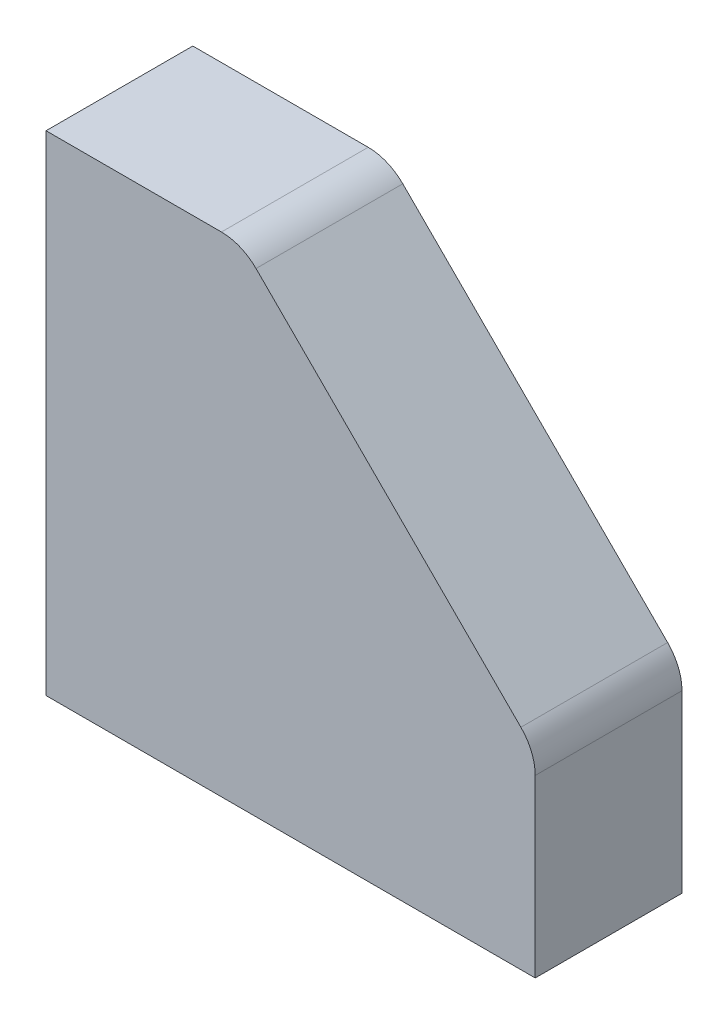
ISO-10303-21;
HEADER;
FILE_DESCRIPTION(('STEP AP214'),'2;1');
FILE_NAME('part.step','',(''),(''),'','','');
FILE_SCHEMA(('AUTOMOTIVE_DESIGN { 1 0 10303 214 1 1 1 1 }'));
ENDSEC;
DATA;
#1=APPLICATION_CONTEXT('core data for automotive mechanical design processes');
#2=APPLICATION_PROTOCOL_DEFINITION('international standard','automotive_design',2000,#1);
#3=PRODUCT_CONTEXT('',#1,'mechanical');
#4=PRODUCT('Part','Part','',(#3));
#5=PRODUCT_RELATED_PRODUCT_CATEGORY('part','',(#4));
#6=PRODUCT_DEFINITION_FORMATION('','',#4);
#7=PRODUCT_DEFINITION_CONTEXT('part definition',#1,'design');
#8=PRODUCT_DEFINITION('design','',#6,#7);
#9=PRODUCT_DEFINITION_SHAPE('','',#8);
#10=(LENGTH_UNIT() NAMED_UNIT(*) SI_UNIT(.MILLI.,.METRE.));
#11=(NAMED_UNIT(*) PLANE_ANGLE_UNIT() SI_UNIT($,.RADIAN.));
#12=(NAMED_UNIT(*) SI_UNIT($,.STERADIAN.) SOLID_ANGLE_UNIT());
#13=UNCERTAINTY_MEASURE_WITH_UNIT(LENGTH_MEASURE(1.E-05),#10,'distance_accuracy_value','');
#14=(GEOMETRIC_REPRESENTATION_CONTEXT(3) GLOBAL_UNCERTAINTY_ASSIGNED_CONTEXT((#13)) GLOBAL_UNIT_ASSIGNED_CONTEXT((#10,
#11,#12)) REPRESENTATION_CONTEXT('',''));
#15=CARTESIAN_POINT('',(0.,0.,0.));
#16=DIRECTION('',(0.,0.,1.));
#17=DIRECTION('',(1.,0.,0.));
#18=AXIS2_PLACEMENT_3D('',#15,#16,#17);
#19=CARTESIAN_POINT('',(0.,0.,15.));
#20=DIRECTION('',(1.,0.,0.));
#21=DIRECTION('',(0.,0.,-1.));
#22=AXIS2_PLACEMENT_3D('',#19,#20,#21);
#23=PLANE('',#22);
#24=CARTESIAN_POINT('',(0.,40.,7.5));
#25=DIRECTION('',(-1.,0.,0.));
#26=DIRECTION('',(0.,0.,1.));
#27=AXIS2_PLACEMENT_3D('',#24,#25,#26);
#28=CIRCLE('',#27,1.64999999999999);
#29=CARTESIAN_POINT('',(0.,40.,9.14999999999999));
#30=VERTEX_POINT('',#29);
#31=EDGE_CURVE('E143',#30,#30,#28,.T.);
#32=ORIENTED_EDGE('',*,*,#31,.F.);
#33=EDGE_LOOP('',(#32));
#34=FACE_BOUND('',#33,.T.);
#35=CARTESIAN_POINT('',(0.,15.,7.5));
#36=DIRECTION('',(-1.,0.,0.));
#37=DIRECTION('',(0.,0.,1.));
#38=AXIS2_PLACEMENT_3D('',#35,#36,#37);
#39=CIRCLE('',#38,1.64999999999999);
#40=CARTESIAN_POINT('',(0.,15.,9.15));
#41=VERTEX_POINT('',#40);
#42=EDGE_CURVE('E149',#41,#41,#39,.T.);
#43=ORIENTED_EDGE('',*,*,#42,.F.);
#44=EDGE_LOOP('',(#43));
#45=FACE_BOUND('',#44,.T.);
#46=DIRECTION('',(0.,-1.,0.));
#47=VECTOR('',#46,1.);
#48=CARTESIAN_POINT('',(0.,0.,0.));
#49=LINE('',#48,#47);
#50=CARTESIAN_POINT('',(0.,50.,0.));
#51=VERTEX_POINT('',#50);
#52=CARTESIAN_POINT('',(0.,0.,0.));
#53=VERTEX_POINT('',#52);
#54=EDGE_CURVE('E155',#51,#53,#49,.T.);
#55=ORIENTED_EDGE('',*,*,#54,.T.);
#56=DIRECTION('',(0.,0.,-1.));
#57=VECTOR('',#56,1.);
#58=CARTESIAN_POINT('',(0.,0.,15.));
#59=LINE('',#58,#57);
#60=CARTESIAN_POINT('',(0.,0.,15.));
#61=VERTEX_POINT('',#60);
#62=EDGE_CURVE('E184',#61,#53,#59,.T.);
#63=ORIENTED_EDGE('',*,*,#62,.F.);
#64=DIRECTION('',(0.,-1.,0.));
#65=VECTOR('',#64,1.);
#66=CARTESIAN_POINT('',(0.,0.,15.));
#67=LINE('',#66,#65);
#68=CARTESIAN_POINT('',(0.,50.,15.));
#69=VERTEX_POINT('',#68);
#70=EDGE_CURVE('E156',#69,#61,#67,.T.);
#71=ORIENTED_EDGE('',*,*,#70,.F.);
#72=DIRECTION('',(0.,0.,-1.));
#73=VECTOR('',#72,1.);
#74=CARTESIAN_POINT('',(0.,50.,15.));
#75=LINE('',#74,#73);
#76=EDGE_CURVE('E168',#69,#51,#75,.T.);
#77=ORIENTED_EDGE('',*,*,#76,.T.);
#78=EDGE_LOOP('',(#55,#63,#71,#77));
#79=FACE_BOUND('',#78,.T.);
#80=ADVANCED_FACE('F41',(#34,#45,#79),#23,.F.);
#81=CARTESIAN_POINT('',(50.,0.,15.));
#82=DIRECTION('',(0.,1.,0.));
#83=DIRECTION('',(0.,0.,1.));
#84=AXIS2_PLACEMENT_3D('',#81,#82,#83);
#85=PLANE('',#84);
#86=CARTESIAN_POINT('',(35.,0.,7.5));
#87=DIRECTION('',(0.,-1.,0.));
#88=DIRECTION('',(0.,0.,-1.));
#89=AXIS2_PLACEMENT_3D('',#86,#87,#88);
#90=CIRCLE('',#89,1.64999999999999);
#91=CARTESIAN_POINT('',(35.,0.,5.85000000000001));
#92=VERTEX_POINT('',#91);
#93=EDGE_CURVE('E127',#92,#92,#90,.T.);
#94=ORIENTED_EDGE('',*,*,#93,.F.);
#95=EDGE_LOOP('',(#94));
#96=FACE_BOUND('',#95,.T.);
#97=CARTESIAN_POINT('',(20.,0.,7.5));
#98=DIRECTION('',(0.,-1.,0.));
#99=DIRECTION('',(0.,0.,-1.));
#100=AXIS2_PLACEMENT_3D('',#97,#98,#99);
#101=CIRCLE('',#100,1.64999999999999);
#102=CARTESIAN_POINT('',(20.,0.,5.85000000000001));
#103=VERTEX_POINT('',#102);
#104=EDGE_CURVE('E126',#103,#103,#101,.T.);
#105=ORIENTED_EDGE('',*,*,#104,.F.);
#106=EDGE_LOOP('',(#105));
#107=FACE_BOUND('',#106,.T.);
#108=CARTESIAN_POINT('',(5.00000000000001,0.,7.5));
#109=DIRECTION('',(0.,-1.,0.));
#110=DIRECTION('',(0.,0.,-1.));
#111=AXIS2_PLACEMENT_3D('',#108,#109,#110);
#112=CIRCLE('',#111,1.64999999999999);
#113=CARTESIAN_POINT('',(5.00000000000001,0.,5.85000000000001));
#114=VERTEX_POINT('',#113);
#115=EDGE_CURVE('E137',#114,#114,#112,.T.);
#116=ORIENTED_EDGE('',*,*,#115,.F.);
#117=EDGE_LOOP('',(#116));
#118=FACE_BOUND('',#117,.T.);
#119=DIRECTION('',(1.,0.,0.));
#120=VECTOR('',#119,1.);
#121=CARTESIAN_POINT('',(50.,0.,0.));
#122=LINE('',#121,#120);
#123=CARTESIAN_POINT('',(50.,0.,0.));
#124=VERTEX_POINT('',#123);
#125=EDGE_CURVE('E171',#53,#124,#122,.T.);
#126=ORIENTED_EDGE('',*,*,#125,.T.);
#127=DIRECTION('',(0.,0.,-1.));
#128=VECTOR('',#127,1.);
#129=CARTESIAN_POINT('',(50.,0.,15.));
#130=LINE('',#129,#128);
#131=CARTESIAN_POINT('',(50.,0.,15.));
#132=VERTEX_POINT('',#131);
#133=EDGE_CURVE('E181',#132,#124,#130,.T.);
#134=ORIENTED_EDGE('',*,*,#133,.F.);
#135=DIRECTION('',(1.,0.,0.));
#136=VECTOR('',#135,1.);
#137=CARTESIAN_POINT('',(50.,0.,15.));
#138=LINE('',#137,#136);
#139=EDGE_CURVE('E159',#61,#132,#138,.T.);
#140=ORIENTED_EDGE('',*,*,#139,.F.);
#141=ORIENTED_EDGE('',*,*,#62,.T.);
#142=EDGE_LOOP('',(#126,#134,#140,#141));
#143=FACE_BOUND('',#142,.T.);
#144=ADVANCED_FACE('F213',(#96,#107,#118,#143),#85,.F.);
#145=CARTESIAN_POINT('',(50.,20.,15.));
#146=DIRECTION('',(-1.,0.,0.));
#147=DIRECTION('',(0.,0.,1.));
#148=AXIS2_PLACEMENT_3D('',#145,#146,#147);
#149=PLANE('',#148);
#150=DIRECTION('',(0.,1.,0.));
#151=VECTOR('',#150,1.);
#152=CARTESIAN_POINT('',(50.,20.,0.));
#153=LINE('',#152,#151);
#154=CARTESIAN_POINT('',(50.,17.9289321881345,0.));
#155=VERTEX_POINT('',#154);
#156=EDGE_CURVE('E173',#124,#155,#153,.T.);
#157=ORIENTED_EDGE('',*,*,#156,.T.);
#158=DIRECTION('',(0.,0.,-1.));
#159=VECTOR('',#158,1.);
#160=CARTESIAN_POINT('',(50.,17.9289321881345,15.));
#161=LINE('',#160,#159);
#162=CARTESIAN_POINT('',(50.,17.9289321881345,15.));
#163=VERTEX_POINT('',#162);
#164=EDGE_CURVE('E64',#155,#163,#161,.F.);
#165=ORIENTED_EDGE('',*,*,#164,.T.);
#166=DIRECTION('',(0.,1.,0.));
#167=VECTOR('',#166,1.);
#168=CARTESIAN_POINT('',(50.,20.,15.));
#169=LINE('',#168,#167);
#170=EDGE_CURVE('E162',#132,#163,#169,.T.);
#171=ORIENTED_EDGE('',*,*,#170,.F.);
#172=ORIENTED_EDGE('',*,*,#133,.T.);
#173=EDGE_LOOP('',(#157,#165,#171,#172));
#174=FACE_BOUND('',#173,.T.);
#175=ADVANCED_FACE('F210',(#174),#149,.F.);
#176=CARTESIAN_POINT('',(20.,50.,15.));
#177=DIRECTION('',(-0.707106781186547,-0.707106781186547,0.));
#178=DIRECTION('',(0.707106781186548,-0.707106781186548,0.));
#179=AXIS2_PLACEMENT_3D('',#176,#177,#178);
#180=PLANE('',#179);
#181=DIRECTION('',(-0.707106781186547,0.707106781186547,0.));
#182=VECTOR('',#181,1.);
#183=CARTESIAN_POINT('',(20.,50.,15.));
#184=LINE('',#183,#182);
#185=CARTESIAN_POINT('',(48.5355339059327,21.4644660940673,15.));
#186=VERTEX_POINT('',#185);
#187=CARTESIAN_POINT('',(21.4644660940673,48.5355339059327,15.));
#188=VERTEX_POINT('',#187);
#189=EDGE_CURVE('E164',#186,#188,#184,.T.);
#190=ORIENTED_EDGE('',*,*,#189,.F.);
#191=DIRECTION('',(0.,0.,-1.));
#192=VECTOR('',#191,1.);
#193=CARTESIAN_POINT('',(48.5355339059327,21.4644660940673,15.));
#194=LINE('',#193,#192);
#195=CARTESIAN_POINT('',(48.5355339059327,21.4644660940673,0.));
#196=VERTEX_POINT('',#195);
#197=EDGE_CURVE('E189',#186,#196,#194,.T.);
#198=ORIENTED_EDGE('',*,*,#197,.T.);
#199=DIRECTION('',(-0.707106781186547,0.707106781186547,0.));
#200=VECTOR('',#199,1.);
#201=CARTESIAN_POINT('',(20.,50.,0.));
#202=LINE('',#201,#200);
#203=CARTESIAN_POINT('',(21.4644660940673,48.5355339059327,0.));
#204=VERTEX_POINT('',#203);
#205=EDGE_CURVE('E175',#196,#204,#202,.T.);
#206=ORIENTED_EDGE('',*,*,#205,.T.);
#207=DIRECTION('',(0.,0.,-1.));
#208=VECTOR('',#207,1.);
#209=CARTESIAN_POINT('',(21.4644660940673,48.5355339059327,15.));
#210=LINE('',#209,#208);
#211=EDGE_CURVE('E187',#204,#188,#210,.F.);
#212=ORIENTED_EDGE('',*,*,#211,.T.);
#213=EDGE_LOOP('',(#190,#198,#206,#212));
#214=FACE_BOUND('',#213,.T.);
#215=ADVANCED_FACE('F203',(#214),#180,.F.);
#216=CARTESIAN_POINT('',(0.,50.,15.));
#217=DIRECTION('',(0.,-1.,0.));
#218=DIRECTION('',(0.,0.,-1.));
#219=AXIS2_PLACEMENT_3D('',#216,#217,#218);
#220=PLANE('',#219);
#221=DIRECTION('',(-1.,0.,0.));
#222=VECTOR('',#221,1.);
#223=CARTESIAN_POINT('',(0.,50.,15.));
#224=LINE('',#223,#222);
#225=CARTESIAN_POINT('',(17.9289321881345,50.,15.));
#226=VERTEX_POINT('',#225);
#227=EDGE_CURVE('E166',#226,#69,#224,.T.);
#228=ORIENTED_EDGE('',*,*,#227,.F.);
#229=DIRECTION('',(0.,0.,-1.));
#230=VECTOR('',#229,1.);
#231=CARTESIAN_POINT('',(17.9289321881345,50.,15.));
#232=LINE('',#231,#230);
#233=CARTESIAN_POINT('',(17.9289321881345,50.,0.));
#234=VERTEX_POINT('',#233);
#235=EDGE_CURVE('E11',#226,#234,#232,.T.);
#236=ORIENTED_EDGE('',*,*,#235,.T.);
#237=DIRECTION('',(-1.,0.,0.));
#238=VECTOR('',#237,1.);
#239=CARTESIAN_POINT('',(0.,50.,0.));
#240=LINE('',#239,#238);
#241=EDGE_CURVE('E160',#234,#51,#240,.T.);
#242=ORIENTED_EDGE('',*,*,#241,.T.);
#243=ORIENTED_EDGE('',*,*,#76,.F.);
#244=EDGE_LOOP('',(#228,#236,#242,#243));
#245=FACE_BOUND('',#244,.T.);
#246=ADVANCED_FACE('F221',(#245),#220,.F.);
#247=CARTESIAN_POINT('',(0.,0.,15.));
#248=DIRECTION('',(0.,0.,-1.));
#249=DIRECTION('',(-1.,0.,0.));
#250=AXIS2_PLACEMENT_3D('',#247,#248,#249);
#251=PLANE('',#250);
#252=ORIENTED_EDGE('',*,*,#170,.T.);
#253=CARTESIAN_POINT('',(45.,17.9289321881345,15.));
#254=DIRECTION('',(0.,0.,-1.));
#255=DIRECTION('',(-1.,0.,0.));
#256=AXIS2_PLACEMENT_3D('',#253,#254,#255);
#257=CIRCLE('',#256,5.);
#258=EDGE_CURVE('E49',#163,#186,#257,.F.);
#259=ORIENTED_EDGE('',*,*,#258,.T.);
#260=ORIENTED_EDGE('',*,*,#189,.T.);
#261=CARTESIAN_POINT('',(17.9289321881345,45.,15.));
#262=DIRECTION('',(0.,0.,-1.));
#263=DIRECTION('',(-1.,0.,0.));
#264=AXIS2_PLACEMENT_3D('',#261,#262,#263);
#265=CIRCLE('',#264,5.);
#266=EDGE_CURVE('E56',#188,#226,#265,.F.);
#267=ORIENTED_EDGE('',*,*,#266,.T.);
#268=ORIENTED_EDGE('',*,*,#227,.T.);
#269=ORIENTED_EDGE('',*,*,#70,.T.);
#270=ORIENTED_EDGE('',*,*,#139,.T.);
#271=EDGE_LOOP('',(#252,#259,#260,#267,#268,#269,#270));
#272=FACE_BOUND('',#271,.T.);
#273=ADVANCED_FACE('F199',(#272),#251,.F.);
#274=CARTESIAN_POINT('',(0.,0.,0.));
#275=DIRECTION('',(0.,0.,-1.));
#276=DIRECTION('',(-1.,0.,0.));
#277=AXIS2_PLACEMENT_3D('',#274,#275,#276);
#278=PLANE('',#277);
#279=ORIENTED_EDGE('',*,*,#205,.F.);
#280=CARTESIAN_POINT('',(45.,17.9289321881345,0.));
#281=DIRECTION('',(0.,0.,-1.));
#282=DIRECTION('',(-1.,0.,0.));
#283=AXIS2_PLACEMENT_3D('',#280,#281,#282);
#284=CIRCLE('',#283,5.);
#285=EDGE_CURVE('E194',#196,#155,#284,.T.);
#286=ORIENTED_EDGE('',*,*,#285,.T.);
#287=ORIENTED_EDGE('',*,*,#156,.F.);
#288=ORIENTED_EDGE('',*,*,#125,.F.);
#289=ORIENTED_EDGE('',*,*,#54,.F.);
#290=ORIENTED_EDGE('',*,*,#241,.F.);
#291=CARTESIAN_POINT('',(17.9289321881345,45.,0.));
#292=DIRECTION('',(0.,0.,-1.));
#293=DIRECTION('',(-1.,0.,0.));
#294=AXIS2_PLACEMENT_3D('',#291,#292,#293);
#295=CIRCLE('',#294,5.);
#296=EDGE_CURVE('E192',#234,#204,#295,.T.);
#297=ORIENTED_EDGE('',*,*,#296,.T.);
#298=EDGE_LOOP('',(#279,#286,#287,#288,#289,#290,#297));
#299=FACE_BOUND('',#298,.T.);
#300=ADVANCED_FACE('F209',(#299),#278,.T.);
#301=CARTESIAN_POINT('',(9.10857997860453,15.,7.5));
#302=DIRECTION('',(-1.,0.,0.));
#303=DIRECTION('',(0.,0.,1.));
#304=AXIS2_PLACEMENT_3D('',#301,#302,#303);
#305=CONICAL_SURFACE('',#304,1.65,1.02974425867665);
#306=CARTESIAN_POINT('',(10.1,15.,7.5));
#307=VERTEX_POINT('',#306);
#308=VERTEX_LOOP('',#307);
#309=FACE_BOUND('',#308,.T.);
#310=CARTESIAN_POINT('',(9.10857997860453,15.,7.5));
#311=DIRECTION('',(-1.,0.,0.));
#312=DIRECTION('',(0.,0.,1.));
#313=AXIS2_PLACEMENT_3D('',#310,#311,#312);
#314=CIRCLE('',#313,1.65);
#315=CARTESIAN_POINT('',(9.10857997860453,15.,9.15));
#316=VERTEX_POINT('',#315);
#317=EDGE_CURVE('E152',#316,#316,#314,.T.);
#318=ORIENTED_EDGE('',*,*,#317,.T.);
#319=EDGE_LOOP('',(#318));
#320=FACE_BOUND('',#319,.T.);
#321=ADVANCED_FACE('F247',(#309,#320),#305,.F.);
#322=CARTESIAN_POINT('',(0.,15.,7.5));
#323=DIRECTION('',(-1.,0.,0.));
#324=DIRECTION('',(0.,0.,1.));
#325=AXIS2_PLACEMENT_3D('',#322,#323,#324);
#326=CYLINDRICAL_SURFACE('',#325,1.65);
#327=ORIENTED_EDGE('',*,*,#317,.F.);
#328=EDGE_LOOP('',(#327));
#329=FACE_BOUND('',#328,.T.);
#330=ORIENTED_EDGE('',*,*,#42,.T.);
#331=EDGE_LOOP('',(#330));
#332=FACE_BOUND('',#331,.T.);
#333=ADVANCED_FACE('F252',(#329,#332),#326,.F.);
#334=CARTESIAN_POINT('',(9.10857997860453,40.,7.5));
#335=DIRECTION('',(-1.,0.,0.));
#336=DIRECTION('',(0.,0.,1.));
#337=AXIS2_PLACEMENT_3D('',#334,#335,#336);
#338=CONICAL_SURFACE('',#337,1.65,1.02974425867665);
#339=CARTESIAN_POINT('',(10.1,40.,7.5));
#340=VERTEX_POINT('',#339);
#341=VERTEX_LOOP('',#340);
#342=FACE_BOUND('',#341,.T.);
#343=CARTESIAN_POINT('',(9.10857997860453,40.,7.5));
#344=DIRECTION('',(-1.,0.,0.));
#345=DIRECTION('',(0.,0.,1.));
#346=AXIS2_PLACEMENT_3D('',#343,#344,#345);
#347=CIRCLE('',#346,1.65);
#348=CARTESIAN_POINT('',(9.10857997860453,40.,9.15));
#349=VERTEX_POINT('',#348);
#350=EDGE_CURVE('E146',#349,#349,#347,.T.);
#351=ORIENTED_EDGE('',*,*,#350,.T.);
#352=EDGE_LOOP('',(#351));
#353=FACE_BOUND('',#352,.T.);
#354=ADVANCED_FACE('F256',(#342,#353),#338,.F.);
#355=CARTESIAN_POINT('',(0.,40.,7.5));
#356=DIRECTION('',(-1.,0.,0.));
#357=DIRECTION('',(0.,0.,1.));
#358=AXIS2_PLACEMENT_3D('',#355,#356,#357);
#359=CYLINDRICAL_SURFACE('',#358,1.65);
#360=ORIENTED_EDGE('',*,*,#350,.F.);
#361=EDGE_LOOP('',(#360));
#362=FACE_BOUND('',#361,.T.);
#363=ORIENTED_EDGE('',*,*,#31,.T.);
#364=EDGE_LOOP('',(#363));
#365=FACE_BOUND('',#364,.T.);
#366=ADVANCED_FACE('F260',(#362,#365),#359,.F.);
#367=CARTESIAN_POINT('',(5.00000000000001,9.10857997860453,7.5));
#368=DIRECTION('',(0.,-1.,0.));
#369=DIRECTION('',(0.,0.,-1.));
#370=AXIS2_PLACEMENT_3D('',#367,#368,#369);
#371=CONICAL_SURFACE('',#370,1.65,1.02974425867665);
#372=CARTESIAN_POINT('',(5.,10.1,7.5));
#373=VERTEX_POINT('',#372);
#374=VERTEX_LOOP('',#373);
#375=FACE_BOUND('',#374,.T.);
#376=CARTESIAN_POINT('',(5.00000000000001,9.10857997860453,7.5));
#377=DIRECTION('',(0.,-1.,0.));
#378=DIRECTION('',(0.,0.,-1.));
#379=AXIS2_PLACEMENT_3D('',#376,#377,#378);
#380=CIRCLE('',#379,1.65);
#381=CARTESIAN_POINT('',(5.00000000000001,9.10857997860453,5.85));
#382=VERTEX_POINT('',#381);
#383=EDGE_CURVE('E140',#382,#382,#380,.T.);
#384=ORIENTED_EDGE('',*,*,#383,.T.);
#385=EDGE_LOOP('',(#384));
#386=FACE_BOUND('',#385,.T.);
#387=ADVANCED_FACE('F264',(#375,#386),#371,.F.);
#388=CARTESIAN_POINT('',(5.00000000000001,0.,7.5));
#389=DIRECTION('',(0.,-1.,0.));
#390=DIRECTION('',(0.,0.,-1.));
#391=AXIS2_PLACEMENT_3D('',#388,#389,#390);
#392=CYLINDRICAL_SURFACE('',#391,1.64999999999999);
#393=ORIENTED_EDGE('',*,*,#383,.F.);
#394=EDGE_LOOP('',(#393));
#395=FACE_BOUND('',#394,.T.);
#396=ORIENTED_EDGE('',*,*,#115,.T.);
#397=EDGE_LOOP('',(#396));
#398=FACE_BOUND('',#397,.T.);
#399=ADVANCED_FACE('F268',(#395,#398),#392,.F.);
#400=CARTESIAN_POINT('',(20.,9.10857997860453,7.5));
#401=DIRECTION('',(0.,-1.,0.));
#402=DIRECTION('',(0.,0.,-1.));
#403=AXIS2_PLACEMENT_3D('',#400,#401,#402);
#404=CONICAL_SURFACE('',#403,1.65,1.02974425867665);
#405=CARTESIAN_POINT('',(20.,10.1,7.5));
#406=VERTEX_POINT('',#405);
#407=VERTEX_LOOP('',#406);
#408=FACE_BOUND('',#407,.T.);
#409=CARTESIAN_POINT('',(20.,9.10857997860453,7.5));
#410=DIRECTION('',(0.,-1.,0.));
#411=DIRECTION('',(0.,0.,-1.));
#412=AXIS2_PLACEMENT_3D('',#409,#410,#411);
#413=CIRCLE('',#412,1.65);
#414=CARTESIAN_POINT('',(20.,9.10857997860453,5.85));
#415=VERTEX_POINT('',#414);
#416=EDGE_CURVE('E130',#415,#415,#413,.T.);
#417=ORIENTED_EDGE('',*,*,#416,.T.);
#418=EDGE_LOOP('',(#417));
#419=FACE_BOUND('',#418,.T.);
#420=ADVANCED_FACE('F272',(#408,#419),#404,.F.);
#421=CARTESIAN_POINT('',(20.,0.,7.5));
#422=DIRECTION('',(0.,-1.,0.));
#423=DIRECTION('',(0.,0.,-1.));
#424=AXIS2_PLACEMENT_3D('',#421,#422,#423);
#425=CYLINDRICAL_SURFACE('',#424,1.65);
#426=ORIENTED_EDGE('',*,*,#416,.F.);
#427=EDGE_LOOP('',(#426));
#428=FACE_BOUND('',#427,.T.);
#429=ORIENTED_EDGE('',*,*,#104,.T.);
#430=EDGE_LOOP('',(#429));
#431=FACE_BOUND('',#430,.T.);
#432=ADVANCED_FACE('F120',(#428,#431),#425,.F.);
#433=CARTESIAN_POINT('',(35.,9.10857997860453,7.5));
#434=DIRECTION('',(0.,-1.,0.));
#435=DIRECTION('',(0.,0.,-1.));
#436=AXIS2_PLACEMENT_3D('',#433,#434,#435);
#437=CONICAL_SURFACE('',#436,1.65,1.02974425867665);
#438=CARTESIAN_POINT('',(35.,10.1,7.5));
#439=VERTEX_POINT('',#438);
#440=VERTEX_LOOP('',#439);
#441=FACE_BOUND('',#440,.T.);
#442=CARTESIAN_POINT('',(35.,9.10857997860453,7.5));
#443=DIRECTION('',(0.,-1.,0.));
#444=DIRECTION('',(0.,0.,-1.));
#445=AXIS2_PLACEMENT_3D('',#442,#443,#444);
#446=CIRCLE('',#445,1.65);
#447=CARTESIAN_POINT('',(35.,9.10857997860453,5.85));
#448=VERTEX_POINT('',#447);
#449=EDGE_CURVE('E124',#448,#448,#446,.T.);
#450=ORIENTED_EDGE('',*,*,#449,.T.);
#451=EDGE_LOOP('',(#450));
#452=FACE_BOUND('',#451,.T.);
#453=ADVANCED_FACE('F116',(#441,#452),#437,.F.);
#454=CARTESIAN_POINT('',(35.,0.,7.5));
#455=DIRECTION('',(0.,-1.,0.));
#456=DIRECTION('',(0.,0.,-1.));
#457=AXIS2_PLACEMENT_3D('',#454,#455,#456);
#458=CYLINDRICAL_SURFACE('',#457,1.65);
#459=ORIENTED_EDGE('',*,*,#449,.F.);
#460=EDGE_LOOP('',(#459));
#461=FACE_BOUND('',#460,.T.);
#462=ORIENTED_EDGE('',*,*,#93,.T.);
#463=EDGE_LOOP('',(#462));
#464=FACE_BOUND('',#463,.T.);
#465=ADVANCED_FACE('F119',(#461,#464),#458,.F.);
#466=CARTESIAN_POINT('',(45.,17.9289321881345,15.));
#467=DIRECTION('',(0.,0.,-1.));
#468=DIRECTION('',(-1.,0.,0.));
#469=AXIS2_PLACEMENT_3D('',#466,#467,#468);
#470=CYLINDRICAL_SURFACE('',#469,5.);
#471=ORIENTED_EDGE('',*,*,#258,.F.);
#472=ORIENTED_EDGE('',*,*,#164,.F.);
#473=ORIENTED_EDGE('',*,*,#285,.F.);
#474=ORIENTED_EDGE('',*,*,#197,.F.);
#475=EDGE_LOOP('',(#471,#472,#473,#474));
#476=FACE_BOUND('',#475,.T.);
#477=ADVANCED_FACE('F206',(#476),#470,.T.);
#478=CARTESIAN_POINT('',(17.9289321881345,45.,15.));
#479=DIRECTION('',(0.,0.,-1.));
#480=DIRECTION('',(-1.,0.,0.));
#481=AXIS2_PLACEMENT_3D('',#478,#479,#480);
#482=CYLINDRICAL_SURFACE('',#481,5.);
#483=ORIENTED_EDGE('',*,*,#266,.F.);
#484=ORIENTED_EDGE('',*,*,#211,.F.);
#485=ORIENTED_EDGE('',*,*,#296,.F.);
#486=ORIENTED_EDGE('',*,*,#235,.F.);
#487=EDGE_LOOP('',(#483,#484,#485,#486));
#488=FACE_BOUND('',#487,.T.);
#489=ADVANCED_FACE('F43',(#488),#482,.T.);
#490=CLOSED_SHELL('',(#80,#144,#175,#215,#246,#273,#300,#321,#333,#354,#366,#387,#399,#420,#432,
#453,#465,#477,#489));
#491=MANIFOLD_SOLID_BREP('B2',#490);
#492=ADVANCED_BREP_SHAPE_REPRESENTATION('',(#18,#491),#14);
#493=SHAPE_DEFINITION_REPRESENTATION(#9,#492);
ENDSEC;
END-ISO-10303-21;
